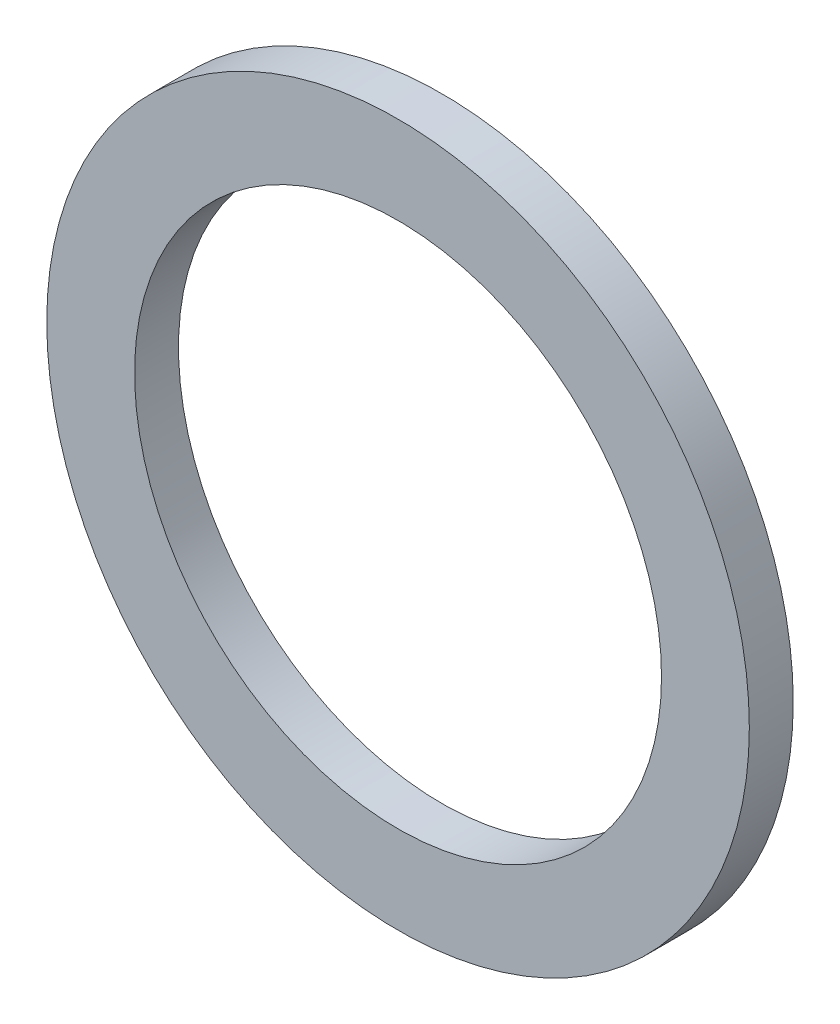
ISO-10303-21;
HEADER;
FILE_DESCRIPTION(('STEP AP214'),'2;1');
FILE_NAME('part.step','',(''),(''),'','','');
FILE_SCHEMA(('AUTOMOTIVE_DESIGN { 1 0 10303 214 1 1 1 1 }'));
ENDSEC;
DATA;
#1=APPLICATION_CONTEXT('core data for automotive mechanical design processes');
#2=APPLICATION_PROTOCOL_DEFINITION('international standard','automotive_design',2000,#1);
#3=PRODUCT_CONTEXT('',#1,'mechanical');
#4=PRODUCT('Part','Part','',(#3));
#5=PRODUCT_RELATED_PRODUCT_CATEGORY('part','',(#4));
#6=PRODUCT_DEFINITION_FORMATION('','',#4);
#7=PRODUCT_DEFINITION_CONTEXT('part definition',#1,'design');
#8=PRODUCT_DEFINITION('design','',#6,#7);
#9=PRODUCT_DEFINITION_SHAPE('','',#8);
#10=(LENGTH_UNIT() NAMED_UNIT(*) SI_UNIT(.MILLI.,.METRE.));
#11=(NAMED_UNIT(*) PLANE_ANGLE_UNIT() SI_UNIT($,.RADIAN.));
#12=(NAMED_UNIT(*) SI_UNIT($,.STERADIAN.) SOLID_ANGLE_UNIT());
#13=UNCERTAINTY_MEASURE_WITH_UNIT(LENGTH_MEASURE(1.E-05),#10,'distance_accuracy_value','');
#14=(GEOMETRIC_REPRESENTATION_CONTEXT(3) GLOBAL_UNCERTAINTY_ASSIGNED_CONTEXT((#13)) GLOBAL_UNIT_ASSIGNED_CONTEXT((#10,
#11,#12)) REPRESENTATION_CONTEXT('',''));
#15=CARTESIAN_POINT('',(0.,0.,0.));
#16=DIRECTION('',(0.,0.,1.));
#17=DIRECTION('',(1.,0.,0.));
#18=AXIS2_PLACEMENT_3D('',#15,#16,#17);
#19=CARTESIAN_POINT('',(0.,0.,1.));
#20=DIRECTION('',(0.,0.,1.));
#21=DIRECTION('',(1.,0.,0.));
#22=AXIS2_PLACEMENT_3D('',#19,#20,#21);
#23=PLANE('',#22);
#24=CARTESIAN_POINT('',(0.,0.,1.));
#25=DIRECTION('',(0.,0.,1.));
#26=DIRECTION('',(1.,0.,0.));
#27=AXIS2_PLACEMENT_3D('',#24,#25,#26);
#28=CIRCLE('',#27,8.);
#29=CARTESIAN_POINT('',(8.,0.,1.));
#30=VERTEX_POINT('',#29);
#31=EDGE_CURVE('E10',#30,#30,#28,.T.);
#32=ORIENTED_EDGE('',*,*,#31,.T.);
#33=EDGE_LOOP('',(#32));
#34=FACE_BOUND('',#33,.T.);
#35=CARTESIAN_POINT('',(0.,0.,1.));
#36=DIRECTION('',(0.,0.,1.));
#37=DIRECTION('',(1.,0.,0.));
#38=AXIS2_PLACEMENT_3D('',#35,#36,#37);
#39=CIRCLE('',#38,6.);
#40=CARTESIAN_POINT('',(6.,0.,1.));
#41=VERTEX_POINT('',#40);
#42=EDGE_CURVE('E49',#41,#41,#39,.T.);
#43=ORIENTED_EDGE('',*,*,#42,.F.);
#44=EDGE_LOOP('',(#43));
#45=FACE_BOUND('',#44,.T.);
#46=ADVANCED_FACE('F38',(#34,#45),#23,.T.);
#47=CARTESIAN_POINT('',(0.,0.,0.));
#48=DIRECTION('',(0.,0.,1.));
#49=DIRECTION('',(1.,0.,0.));
#50=AXIS2_PLACEMENT_3D('',#47,#48,#49);
#51=PLANE('',#50);
#52=CARTESIAN_POINT('',(0.,0.,0.));
#53=DIRECTION('',(0.,0.,1.));
#54=DIRECTION('',(1.,0.,0.));
#55=AXIS2_PLACEMENT_3D('',#52,#53,#54);
#56=CIRCLE('',#55,8.);
#57=CARTESIAN_POINT('',(8.,0.,0.));
#58=VERTEX_POINT('',#57);
#59=EDGE_CURVE('E42',#58,#58,#56,.T.);
#60=ORIENTED_EDGE('',*,*,#59,.F.);
#61=EDGE_LOOP('',(#60));
#62=FACE_BOUND('',#61,.T.);
#63=CARTESIAN_POINT('',(0.,0.,0.));
#64=DIRECTION('',(0.,0.,1.));
#65=DIRECTION('',(1.,0.,0.));
#66=AXIS2_PLACEMENT_3D('',#63,#64,#65);
#67=CIRCLE('',#66,6.);
#68=CARTESIAN_POINT('',(6.,0.,0.));
#69=VERTEX_POINT('',#68);
#70=EDGE_CURVE('E51',#69,#69,#67,.T.);
#71=ORIENTED_EDGE('',*,*,#70,.T.);
#72=EDGE_LOOP('',(#71));
#73=FACE_BOUND('',#72,.T.);
#74=ADVANCED_FACE('F61',(#62,#73),#51,.F.);
#75=CARTESIAN_POINT('',(0.,0.,1.));
#76=DIRECTION('',(0.,0.,-1.));
#77=DIRECTION('',(-1.,0.,0.));
#78=AXIS2_PLACEMENT_3D('',#75,#76,#77);
#79=CYLINDRICAL_SURFACE('',#78,8.);
#80=ORIENTED_EDGE('',*,*,#31,.F.);
#81=EDGE_LOOP('',(#80));
#82=FACE_BOUND('',#81,.T.);
#83=ORIENTED_EDGE('',*,*,#59,.T.);
#84=EDGE_LOOP('',(#83));
#85=FACE_BOUND('',#84,.T.);
#86=ADVANCED_FACE('F40',(#82,#85),#79,.T.);
#87=CARTESIAN_POINT('',(0.,0.,1.));
#88=DIRECTION('',(0.,0.,-1.));
#89=DIRECTION('',(-1.,0.,0.));
#90=AXIS2_PLACEMENT_3D('',#87,#88,#89);
#91=CYLINDRICAL_SURFACE('',#90,6.);
#92=ORIENTED_EDGE('',*,*,#42,.T.);
#93=EDGE_LOOP('',(#92));
#94=FACE_BOUND('',#93,.T.);
#95=ORIENTED_EDGE('',*,*,#70,.F.);
#96=EDGE_LOOP('',(#95));
#97=FACE_BOUND('',#96,.T.);
#98=ADVANCED_FACE('F57',(#94,#97),#91,.F.);
#99=CLOSED_SHELL('',(#46,#74,#86,#98));
#100=MANIFOLD_SOLID_BREP('B2',#99);
#101=ADVANCED_BREP_SHAPE_REPRESENTATION('',(#18,#100),#14);
#102=SHAPE_DEFINITION_REPRESENTATION(#9,#101);
ENDSEC;
END-ISO-10303-21;
